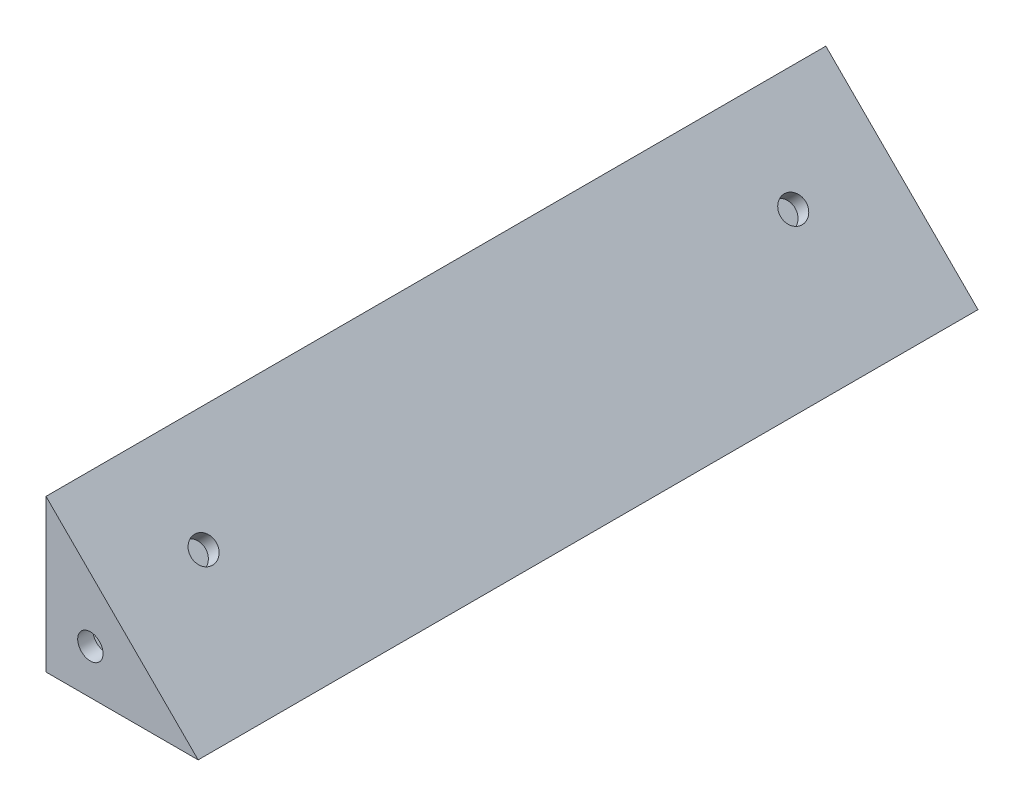
ISO-10303-21;
HEADER;
FILE_DESCRIPTION(('STEP AP214'),'2;1');
FILE_NAME('part.step','',(''),(''),'','','');
FILE_SCHEMA(('AUTOMOTIVE_DESIGN { 1 0 10303 214 1 1 1 1 }'));
ENDSEC;
DATA;
#1=APPLICATION_CONTEXT('core data for automotive mechanical design processes');
#2=APPLICATION_PROTOCOL_DEFINITION('international standard','automotive_design',2000,#1);
#3=PRODUCT_CONTEXT('',#1,'mechanical');
#4=PRODUCT('Part','Part','',(#3));
#5=PRODUCT_RELATED_PRODUCT_CATEGORY('part','',(#4));
#6=PRODUCT_DEFINITION_FORMATION('','',#4);
#7=PRODUCT_DEFINITION_CONTEXT('part definition',#1,'design');
#8=PRODUCT_DEFINITION('design','',#6,#7);
#9=PRODUCT_DEFINITION_SHAPE('','',#8);
#10=(LENGTH_UNIT() NAMED_UNIT(*) SI_UNIT(.MILLI.,.METRE.));
#11=(NAMED_UNIT(*) PLANE_ANGLE_UNIT() SI_UNIT($,.RADIAN.));
#12=(NAMED_UNIT(*) SI_UNIT($,.STERADIAN.) SOLID_ANGLE_UNIT());
#13=UNCERTAINTY_MEASURE_WITH_UNIT(LENGTH_MEASURE(1.E-05),#10,'distance_accuracy_value','');
#14=(GEOMETRIC_REPRESENTATION_CONTEXT(3) GLOBAL_UNCERTAINTY_ASSIGNED_CONTEXT((#13)) GLOBAL_UNIT_ASSIGNED_CONTEXT((#10,
#11,#12)) REPRESENTATION_CONTEXT('',''));
#15=CARTESIAN_POINT('',(0.,0.,0.));
#16=DIRECTION('',(0.,0.,1.));
#17=DIRECTION('',(1.,0.,0.));
#18=AXIS2_PLACEMENT_3D('',#15,#16,#17);
#19=CARTESIAN_POINT('',(3.73725830020305,3.73725830020305,5.));
#20=DIRECTION('',(0.,0.,-1.));
#21=DIRECTION('',(0.,1.,0.));
#22=AXIS2_PLACEMENT_3D('',#19,#20,#21);
#23=PLANE('',#22);
#24=DIRECTION('',(-0.707106781186547,0.707106781186548,0.));
#25=VECTOR('',#24,1.);
#26=CARTESIAN_POINT('',(5.15147186257615,5.15147186257615,5.));
#27=LINE('',#26,#25);
#28=CARTESIAN_POINT('',(10.3029437251523,0.,5.));
#29=VERTEX_POINT('',#28);
#30=CARTESIAN_POINT('',(3.05978332455101,7.24316040060128,5.));
#31=VERTEX_POINT('',#30);
#32=EDGE_CURVE('E245',#29,#31,#27,.T.);
#33=ORIENTED_EDGE('',*,*,#32,.T.);
#34=DIRECTION('',(0.707106781186548,0.707106781186548,0.));
#35=VECTOR('',#34,1.);
#36=CARTESIAN_POINT('',(1.64556976217791,5.82894683822819,5.));
#37=LINE('',#36,#35);
#38=CARTESIAN_POINT('',(1.64556976217791,5.82894683822819,5.));
#39=VERTEX_POINT('',#38);
#40=EDGE_CURVE('E338',#39,#31,#37,.T.);
#41=ORIENTED_EDGE('',*,*,#40,.F.);
#42=DIRECTION('',(-0.707106781186547,0.707106781186548,0.));
#43=VECTOR('',#42,1.);
#44=CARTESIAN_POINT('',(3.73725830020305,3.73725830020305,5.));
#45=LINE('',#44,#43);
#46=CARTESIAN_POINT('',(7.4745166004061,0.,5.));
#47=VERTEX_POINT('',#46);
#48=EDGE_CURVE('E247',#47,#39,#45,.T.);
#49=ORIENTED_EDGE('',*,*,#48,.F.);
#50=DIRECTION('',(-1.,0.,0.));
#51=VECTOR('',#50,1.);
#52=CARTESIAN_POINT('',(0.,0.,5.));
#53=LINE('',#52,#51);
#54=EDGE_CURVE('E239',#29,#47,#53,.T.);
#55=ORIENTED_EDGE('',*,*,#54,.F.);
#56=EDGE_LOOP('',(#33,#41,#49,#55));
#57=FACE_BOUND('',#56,.T.);
#58=ADVANCED_FACE('F80',(#57),#23,.F.);
#59=CARTESIAN_POINT('',(3.73725830020305,3.73725830020305,10.));
#60=DIRECTION('',(0.,0.,1.));
#61=DIRECTION('',(1.,0.,0.));
#62=AXIS2_PLACEMENT_3D('',#59,#60,#61);
#63=PLANE('',#62);
#64=DIRECTION('',(0.707106781186547,-0.707106781186548,0.));
#65=VECTOR('',#64,1.);
#66=CARTESIAN_POINT('',(5.15147186257615,5.15147186257615,10.));
#67=LINE('',#66,#65);
#68=CARTESIAN_POINT('',(3.05978332455101,7.24316040060128,10.));
#69=VERTEX_POINT('',#68);
#70=CARTESIAN_POINT('',(10.3029437251523,0.,10.));
#71=VERTEX_POINT('',#70);
#72=EDGE_CURVE('E268',#69,#71,#67,.T.);
#73=ORIENTED_EDGE('',*,*,#72,.T.);
#74=DIRECTION('',(1.,0.,0.));
#75=VECTOR('',#74,1.);
#76=CARTESIAN_POINT('',(0.,0.,10.));
#77=LINE('',#76,#75);
#78=CARTESIAN_POINT('',(7.4745166004061,0.,10.));
#79=VERTEX_POINT('',#78);
#80=EDGE_CURVE('E241',#79,#71,#77,.T.);
#81=ORIENTED_EDGE('',*,*,#80,.F.);
#82=DIRECTION('',(0.707106781186547,-0.707106781186548,0.));
#83=VECTOR('',#82,1.);
#84=CARTESIAN_POINT('',(3.73725830020305,3.73725830020305,10.));
#85=LINE('',#84,#83);
#86=CARTESIAN_POINT('',(1.64556976217791,5.82894683822819,10.));
#87=VERTEX_POINT('',#86);
#88=EDGE_CURVE('E334',#87,#79,#85,.T.);
#89=ORIENTED_EDGE('',*,*,#88,.F.);
#90=DIRECTION('',(0.707106781186548,0.707106781186548,0.));
#91=VECTOR('',#90,1.);
#92=CARTESIAN_POINT('',(1.64556976217791,5.82894683822819,10.));
#93=LINE('',#92,#91);
#94=EDGE_CURVE('E301',#87,#69,#93,.T.);
#95=ORIENTED_EDGE('',*,*,#94,.T.);
#96=EDGE_LOOP('',(#73,#81,#89,#95));
#97=FACE_BOUND('',#96,.T.);
#98=ADVANCED_FACE('F553',(#97),#63,.F.);
#99=CARTESIAN_POINT('',(-0.893370281794774,8.36788688220088,3.78089240474743));
#100=DIRECTION('',(-0.612372435695794,0.612372435695795,0.5));
#101=DIRECTION('',(-0.707106781186548,-0.707106781186548,0.));
#102=AXIS2_PLACEMENT_3D('',#99,#100,#101);
#103=PLANE('',#102);
#104=DIRECTION('',(0.353553390593274,-0.353553390593274,0.866025403784439));
#105=VECTOR('',#104,1.);
#106=CARTESIAN_POINT('',(0.520843280578321,9.78210044457397,3.78089240474743));
#107=LINE('',#106,#105);
#108=CARTESIAN_POINT('',(2.03916259839135,8.26378112676094,7.5));
#109=VERTEX_POINT('',#108);
#110=EDGE_CURVE('E102',#109,#69,#107,.T.);
#111=ORIENTED_EDGE('',*,*,#110,.T.);
#112=ORIENTED_EDGE('',*,*,#94,.F.);
#113=DIRECTION('',(0.353553390593274,-0.353553390593274,0.866025403784439));
#114=VECTOR('',#113,1.);
#115=CARTESIAN_POINT('',(-0.893370281794774,8.36788688220088,3.78089240474743));
#116=LINE('',#115,#114);
#117=CARTESIAN_POINT('',(0.624949036018256,6.84956756438784,7.5));
#118=VERTEX_POINT('',#117);
#119=EDGE_CURVE('E330',#118,#87,#116,.T.);
#120=ORIENTED_EDGE('',*,*,#119,.F.);
#121=DIRECTION('',(0.707106781186548,0.707106781186548,0.));
#122=VECTOR('',#121,1.);
#123=CARTESIAN_POINT('',(0.624949036018256,6.84956756438784,7.5));
#124=LINE('',#123,#122);
#125=EDGE_CURVE('E341',#118,#109,#124,.T.);
#126=ORIENTED_EDGE('',*,*,#125,.T.);
#127=EDGE_LOOP('',(#111,#112,#120,#126));
#128=FACE_BOUND('',#127,.T.);
#129=ADVANCED_FACE('F558',(#128),#103,.F.);
#130=CARTESIAN_POINT('',(3.69942298592369,3.77509361448241,-0.0308924047474255));
#131=DIRECTION('',(-0.612372435695794,0.612372435695794,-0.500000000000001));
#132=DIRECTION('',(-0.707106781186548,-0.707106781186548,0.));
#133=AXIS2_PLACEMENT_3D('',#130,#131,#132);
#134=PLANE('',#133);
#135=DIRECTION('',(-0.353553390593274,0.353553390593274,0.866025403784438));
#136=VECTOR('',#135,1.);
#137=CARTESIAN_POINT('',(5.11363654829678,5.18930717685551,-0.0308924047474255));
#138=LINE('',#137,#136);
#139=EDGE_CURVE('E254',#31,#109,#138,.T.);
#140=ORIENTED_EDGE('',*,*,#139,.T.);
#141=ORIENTED_EDGE('',*,*,#125,.F.);
#142=DIRECTION('',(-0.353553390593274,0.353553390593274,0.866025403784438));
#143=VECTOR('',#142,1.);
#144=CARTESIAN_POINT('',(3.69942298592369,3.77509361448241,-0.0308924047474255));
#145=LINE('',#144,#143);
#146=EDGE_CURVE('E326',#39,#118,#145,.T.);
#147=ORIENTED_EDGE('',*,*,#146,.F.);
#148=ORIENTED_EDGE('',*,*,#40,.T.);
#149=EDGE_LOOP('',(#140,#141,#147,#148));
#150=FACE_BOUND('',#149,.T.);
#151=ADVANCED_FACE('F563',(#150),#134,.F.);
#152=CARTESIAN_POINT('',(3.73725830020305,3.73725830020305,56.5));
#153=DIRECTION('',(0.,0.,1.));
#154=DIRECTION('',(1.,0.,0.));
#155=AXIS2_PLACEMENT_3D('',#152,#153,#154);
#156=PLANE('',#155);
#157=DIRECTION('',(0.707106781186547,-0.707106781186548,0.));
#158=VECTOR('',#157,1.);
#159=CARTESIAN_POINT('',(5.15147186257615,5.15147186257615,56.5));
#160=LINE('',#159,#158);
#161=CARTESIAN_POINT('',(3.05978332455102,7.24316040060128,56.5));
#162=VERTEX_POINT('',#161);
#163=CARTESIAN_POINT('',(10.3029437251523,0.,56.5));
#164=VERTEX_POINT('',#163);
#165=EDGE_CURVE('E280',#162,#164,#160,.T.);
#166=ORIENTED_EDGE('',*,*,#165,.T.);
#167=DIRECTION('',(1.,0.,0.));
#168=VECTOR('',#167,1.);
#169=CARTESIAN_POINT('',(0.,0.,56.5));
#170=LINE('',#169,#168);
#171=CARTESIAN_POINT('',(7.4745166004061,0.,56.5));
#172=VERTEX_POINT('',#171);
#173=EDGE_CURVE('E350',#172,#164,#170,.T.);
#174=ORIENTED_EDGE('',*,*,#173,.F.);
#175=DIRECTION('',(0.707106781186547,-0.707106781186548,0.));
#176=VECTOR('',#175,1.);
#177=CARTESIAN_POINT('',(3.73725830020305,3.73725830020305,56.5));
#178=LINE('',#177,#176);
#179=CARTESIAN_POINT('',(1.64556976217792,5.82894683822819,56.5));
#180=VERTEX_POINT('',#179);
#181=EDGE_CURVE('E296',#180,#172,#178,.T.);
#182=ORIENTED_EDGE('',*,*,#181,.F.);
#183=DIRECTION('',(0.707106781186548,0.707106781186548,0.));
#184=VECTOR('',#183,1.);
#185=CARTESIAN_POINT('',(1.64556976217792,5.82894683822819,56.5));
#186=LINE('',#185,#184);
#187=EDGE_CURVE('E313',#180,#162,#186,.T.);
#188=ORIENTED_EDGE('',*,*,#187,.T.);
#189=EDGE_LOOP('',(#166,#174,#182,#188));
#190=FACE_BOUND('',#189,.T.);
#191=ADVANCED_FACE('F535',(#190),#156,.F.);
#192=CARTESIAN_POINT('',(3.73725830020305,3.73725830020305,51.5));
#193=DIRECTION('',(0.,0.,-1.));
#194=DIRECTION('',(-1.,0.,0.));
#195=AXIS2_PLACEMENT_3D('',#192,#193,#194);
#196=PLANE('',#195);
#197=DIRECTION('',(-0.707106781186547,0.707106781186548,0.));
#198=VECTOR('',#197,1.);
#199=CARTESIAN_POINT('',(5.15147186257615,5.15147186257615,51.5));
#200=LINE('',#199,#198);
#201=CARTESIAN_POINT('',(10.3029437251523,0.,51.5));
#202=VERTEX_POINT('',#201);
#203=CARTESIAN_POINT('',(3.05978332455101,7.24316040060129,51.5));
#204=VERTEX_POINT('',#203);
#205=EDGE_CURVE('E284',#202,#204,#200,.T.);
#206=ORIENTED_EDGE('',*,*,#205,.T.);
#207=DIRECTION('',(0.707106781186548,0.707106781186548,0.));
#208=VECTOR('',#207,1.);
#209=CARTESIAN_POINT('',(1.64556976217791,5.82894683822819,51.5));
#210=LINE('',#209,#208);
#211=CARTESIAN_POINT('',(1.64556976217791,5.82894683822819,51.5));
#212=VERTEX_POINT('',#211);
#213=EDGE_CURVE('E312',#212,#204,#210,.T.);
#214=ORIENTED_EDGE('',*,*,#213,.F.);
#215=DIRECTION('',(-0.707106781186547,0.707106781186548,0.));
#216=VECTOR('',#215,1.);
#217=CARTESIAN_POINT('',(3.73725830020305,3.73725830020305,51.5));
#218=LINE('',#217,#216);
#219=CARTESIAN_POINT('',(7.4745166004061,0.,51.5));
#220=VERTEX_POINT('',#219);
#221=EDGE_CURVE('E300',#220,#212,#218,.T.);
#222=ORIENTED_EDGE('',*,*,#221,.F.);
#223=DIRECTION('',(-1.,0.,0.));
#224=VECTOR('',#223,1.);
#225=CARTESIAN_POINT('',(0.,0.,51.5));
#226=LINE('',#225,#224);
#227=EDGE_CURVE('E249',#202,#220,#226,.T.);
#228=ORIENTED_EDGE('',*,*,#227,.F.);
#229=EDGE_LOOP('',(#206,#214,#222,#228));
#230=FACE_BOUND('',#229,.T.);
#231=ADVANCED_FACE('F523',(#230),#196,.F.);
#232=CARTESIAN_POINT('',(-15.131029411722,22.6055460121281,15.4058924047474));
#233=DIRECTION('',(-0.612372435695794,0.612372435695795,0.5));
#234=DIRECTION('',(-0.707106781186548,-0.707106781186548,0.));
#235=AXIS2_PLACEMENT_3D('',#232,#233,#234);
#236=PLANE('',#235);
#237=DIRECTION('',(0.353553390593274,-0.353553390593274,0.866025403784439));
#238=VECTOR('',#237,1.);
#239=CARTESIAN_POINT('',(-13.7168158493489,24.0197595745012,15.4058924047474));
#240=LINE('',#239,#238);
#241=CARTESIAN_POINT('',(2.03916259839135,8.26378112676094,54.));
#242=VERTEX_POINT('',#241);
#243=EDGE_CURVE('E290',#242,#162,#240,.T.);
#244=ORIENTED_EDGE('',*,*,#243,.T.);
#245=ORIENTED_EDGE('',*,*,#187,.F.);
#246=DIRECTION('',(0.353553390593274,-0.353553390593274,0.866025403784439));
#247=VECTOR('',#246,1.);
#248=CARTESIAN_POINT('',(-15.131029411722,22.6055460121281,15.4058924047474));
#249=LINE('',#248,#247);
#250=CARTESIAN_POINT('',(0.624949036018258,6.84956756438785,54.));
#251=VERTEX_POINT('',#250);
#252=EDGE_CURVE('E308',#251,#180,#249,.T.);
#253=ORIENTED_EDGE('',*,*,#252,.F.);
#254=DIRECTION('',(0.707106781186548,0.707106781186548,0.));
#255=VECTOR('',#254,1.);
#256=CARTESIAN_POINT('',(0.624949036018258,6.84956756438785,54.));
#257=LINE('',#256,#255);
#258=EDGE_CURVE('E317',#251,#242,#257,.T.);
#259=ORIENTED_EDGE('',*,*,#258,.T.);
#260=EDGE_LOOP('',(#244,#245,#253,#259));
#261=FACE_BOUND('',#260,.T.);
#262=ADVANCED_FACE('F531',(#261),#236,.F.);
#263=CARTESIAN_POINT('',(17.9370821158509,-10.4625655154448,11.5941075952526));
#264=DIRECTION('',(-0.612372435695794,0.612372435695795,-0.5));
#265=DIRECTION('',(-0.707106781186548,-0.707106781186548,0.));
#266=AXIS2_PLACEMENT_3D('',#263,#264,#265);
#267=PLANE('',#266);
#268=DIRECTION('',(-0.353553390593274,0.353553390593274,0.866025403784439));
#269=VECTOR('',#268,1.);
#270=CARTESIAN_POINT('',(19.351295678224,-9.04835195307171,11.5941075952526));
#271=LINE('',#270,#269);
#272=EDGE_CURVE('E287',#204,#242,#271,.T.);
#273=ORIENTED_EDGE('',*,*,#272,.T.);
#274=ORIENTED_EDGE('',*,*,#258,.F.);
#275=DIRECTION('',(-0.353553390593274,0.353553390593274,0.866025403784439));
#276=VECTOR('',#275,1.);
#277=CARTESIAN_POINT('',(17.9370821158509,-10.4625655154448,11.5941075952526));
#278=LINE('',#277,#276);
#279=EDGE_CURVE('E304',#212,#251,#278,.T.);
#280=ORIENTED_EDGE('',*,*,#279,.F.);
#281=ORIENTED_EDGE('',*,*,#213,.T.);
#282=EDGE_LOOP('',(#273,#274,#280,#281));
#283=FACE_BOUND('',#282,.T.);
#284=ADVANCED_FACE('F528',(#283),#267,.F.);
#285=CARTESIAN_POINT('',(1.73223304703364,1.73223304703364,58.3));
#286=DIRECTION('',(-0.707106781186548,-0.707106781186548,0.));
#287=DIRECTION('',(0.707106781186548,-0.707106781186548,0.));
#288=AXIS2_PLACEMENT_3D('',#285,#286,#287);
#289=PLANE('',#288);
#290=DIRECTION('',(0.707106781186547,-0.707106781186548,0.));
#291=VECTOR('',#290,1.);
#292=CARTESIAN_POINT('',(1.73223304703364,1.73223304703364,60.3));
#293=LINE('',#292,#291);
#294=CARTESIAN_POINT('',(0.711612320873983,2.75285377319329,60.3));
#295=VERTEX_POINT('',#294);
#296=CARTESIAN_POINT('',(3.46446609406726,0.,60.3));
#297=VERTEX_POINT('',#296);
#298=EDGE_CURVE('E359',#295,#297,#293,.T.);
#299=ORIENTED_EDGE('',*,*,#298,.T.);
#300=DIRECTION('',(0.,0.,1.));
#301=VECTOR('',#300,1.);
#302=CARTESIAN_POINT('',(3.46446609406726,0.,58.3));
#303=LINE('',#302,#301);
#304=CARTESIAN_POINT('',(3.46446609406726,0.,58.3));
#305=VERTEX_POINT('',#304);
#306=EDGE_CURVE('E398',#305,#297,#303,.T.);
#307=ORIENTED_EDGE('',*,*,#306,.F.);
#308=DIRECTION('',(0.707106781186547,-0.707106781186548,0.));
#309=VECTOR('',#308,1.);
#310=CARTESIAN_POINT('',(1.73223304703364,1.73223304703364,58.3));
#311=LINE('',#310,#309);
#312=CARTESIAN_POINT('',(0.711612320873983,2.75285377319329,58.3));
#313=VERTEX_POINT('',#312);
#314=EDGE_CURVE('E375',#313,#305,#311,.T.);
#315=ORIENTED_EDGE('',*,*,#314,.F.);
#316=DIRECTION('',(0.,0.,1.));
#317=VECTOR('',#316,1.);
#318=CARTESIAN_POINT('',(0.711612320873983,2.75285377319329,58.3));
#319=LINE('',#318,#317);
#320=EDGE_CURVE('E399',#313,#295,#319,.T.);
#321=ORIENTED_EDGE('',*,*,#320,.T.);
#322=EDGE_LOOP('',(#299,#307,#315,#321));
#323=FACE_BOUND('',#322,.T.);
#324=ADVANCED_FACE('F583',(#323),#289,.F.);
#325=CARTESIAN_POINT('',(-0.0242701090998959,0.00650315613353235,58.3));
#326=DIRECTION('',(-0.965925826289068,0.258819045102521,0.));
#327=DIRECTION('',(-0.258819045102521,-0.965925826289068,0.));
#328=AXIS2_PLACEMENT_3D('',#325,#326,#327);
#329=PLANE('',#328);
#330=DIRECTION('',(-0.258819045102521,-0.965925826289068,0.));
#331=VECTOR('',#330,1.);
#332=CARTESIAN_POINT('',(-0.0242701090998959,0.00650315613353235,60.3));
#333=LINE('',#332,#331);
#334=CARTESIAN_POINT('',(1.45875854768069,5.54124145231931,60.3));
#335=VERTEX_POINT('',#334);
#336=EDGE_CURVE('E372',#335,#295,#333,.T.);
#337=ORIENTED_EDGE('',*,*,#336,.T.);
#338=ORIENTED_EDGE('',*,*,#320,.F.);
#339=DIRECTION('',(-0.258819045102521,-0.965925826289068,0.));
#340=VECTOR('',#339,1.);
#341=CARTESIAN_POINT('',(-0.0242701090998959,0.00650315613353235,58.3));
#342=LINE('',#341,#340);
#343=CARTESIAN_POINT('',(1.45875854768069,5.54124145231931,58.3));
#344=VERTEX_POINT('',#343);
#345=EDGE_CURVE('E394',#344,#313,#342,.T.);
#346=ORIENTED_EDGE('',*,*,#345,.F.);
#347=DIRECTION('',(0.,0.,1.));
#348=VECTOR('',#347,1.);
#349=CARTESIAN_POINT('',(1.45875854768069,5.54124145231931,58.3));
#350=LINE('',#349,#348);
#351=EDGE_CURVE('E404',#344,#335,#350,.T.);
#352=ORIENTED_EDGE('',*,*,#351,.T.);
#353=EDGE_LOOP('',(#337,#338,#346,#352));
#354=FACE_BOUND('',#353,.T.);
#355=ADVANCED_FACE('F579',(#354),#329,.F.);
#356=CARTESIAN_POINT('',(-1.28759206937907,4.80535902234543,58.3));
#357=DIRECTION('',(-0.258819045102521,0.965925826289068,0.));
#358=DIRECTION('',(-0.965925826289068,-0.258819045102521,0.));
#359=AXIS2_PLACEMENT_3D('',#356,#357,#358);
#360=PLANE('',#359);
#361=DIRECTION('',(-0.965925826289068,-0.258819045102521,0.));
#362=VECTOR('',#361,1.);
#363=CARTESIAN_POINT('',(-1.28759206937907,4.80535902234543,60.3));
#364=LINE('',#363,#362);
#365=CARTESIAN_POINT('',(4.24714622680671,6.28838767912602,60.3));
#366=VERTEX_POINT('',#365);
#367=EDGE_CURVE('E369',#366,#335,#364,.T.);
#368=ORIENTED_EDGE('',*,*,#367,.T.);
#369=ORIENTED_EDGE('',*,*,#351,.F.);
#370=DIRECTION('',(-0.965925826289068,-0.258819045102521,0.));
#371=VECTOR('',#370,1.);
#372=CARTESIAN_POINT('',(-1.28759206937907,4.80535902234543,58.3));
#373=LINE('',#372,#371);
#374=CARTESIAN_POINT('',(4.24714622680671,6.28838767912602,58.3));
#375=VERTEX_POINT('',#374);
#376=EDGE_CURVE('E390',#375,#344,#373,.T.);
#377=ORIENTED_EDGE('',*,*,#376,.F.);
#378=DIRECTION('',(0.,0.,1.));
#379=VECTOR('',#378,1.);
#380=CARTESIAN_POINT('',(4.24714622680671,6.28838767912602,58.3));
#381=LINE('',#380,#379);
#382=EDGE_CURVE('E408',#375,#366,#381,.T.);
#383=ORIENTED_EDGE('',*,*,#382,.T.);
#384=EDGE_LOOP('',(#368,#369,#377,#383));
#385=FACE_BOUND('',#384,.T.);
#386=ADVANCED_FACE('F582',(#385),#360,.F.);
#387=CARTESIAN_POINT('',(5.26776695296636,5.26776695296636,58.3));
#388=DIRECTION('',(0.707106781186547,0.707106781186548,0.));
#389=DIRECTION('',(-0.707106781186548,0.707106781186547,0.));
#390=AXIS2_PLACEMENT_3D('',#387,#388,#389);
#391=PLANE('',#390);
#392=DIRECTION('',(-0.707106781186548,0.707106781186547,0.));
#393=VECTOR('',#392,1.);
#394=CARTESIAN_POINT('',(5.26776695296636,5.26776695296636,60.3));
#395=LINE('',#394,#393);
#396=CARTESIAN_POINT('',(10.5355339059327,0.,60.3));
#397=VERTEX_POINT('',#396);
#398=EDGE_CURVE('E366',#397,#366,#395,.T.);
#399=ORIENTED_EDGE('',*,*,#398,.T.);
#400=ORIENTED_EDGE('',*,*,#382,.F.);
#401=DIRECTION('',(-0.707106781186548,0.707106781186547,0.));
#402=VECTOR('',#401,1.);
#403=CARTESIAN_POINT('',(5.26776695296636,5.26776695296636,58.3));
#404=LINE('',#403,#402);
#405=CARTESIAN_POINT('',(10.5355339059327,0.,58.3));
#406=VERTEX_POINT('',#405);
#407=EDGE_CURVE('E386',#406,#375,#404,.T.);
#408=ORIENTED_EDGE('',*,*,#407,.F.);
#409=DIRECTION('',(0.,0.,1.));
#410=VECTOR('',#409,1.);
#411=CARTESIAN_POINT('',(10.5355339059327,0.,58.3));
#412=LINE('',#411,#410);
#413=EDGE_CURVE('E412',#406,#397,#412,.T.);
#414=ORIENTED_EDGE('',*,*,#413,.T.);
#415=EDGE_LOOP('',(#399,#400,#408,#414));
#416=FACE_BOUND('',#415,.T.);
#417=ADVANCED_FACE('F587',(#416),#391,.F.);
#418=CARTESIAN_POINT('',(0.,0.,61.5));
#419=DIRECTION('',(0.,1.,0.));
#420=DIRECTION('',(0.,0.,1.));
#421=AXIS2_PLACEMENT_3D('',#418,#419,#420);
#422=PLANE('',#421);
#423=DIRECTION('',(1.,0.,0.));
#424=VECTOR('',#423,1.);
#425=CARTESIAN_POINT('',(0.,0.,0.));
#426=LINE('',#425,#424);
#427=CARTESIAN_POINT('',(0.,0.,0.));
#428=VERTEX_POINT('',#427);
#429=CARTESIAN_POINT('',(12.,0.,0.));
#430=VERTEX_POINT('',#429);
#431=EDGE_CURVE('E495',#428,#430,#426,.T.);
#432=ORIENTED_EDGE('',*,*,#431,.T.);
#433=DIRECTION('',(0.,0.,-1.));
#434=VECTOR('',#433,1.);
#435=CARTESIAN_POINT('',(12.,0.,61.5));
#436=LINE('',#435,#434);
#437=CARTESIAN_POINT('',(12.,0.,61.5));
#438=VERTEX_POINT('',#437);
#439=EDGE_CURVE('E504',#438,#430,#436,.T.);
#440=ORIENTED_EDGE('',*,*,#439,.F.);
#441=DIRECTION('',(1.,0.,0.));
#442=VECTOR('',#441,1.);
#443=CARTESIAN_POINT('',(0.,0.,61.5));
#444=LINE('',#443,#442);
#445=CARTESIAN_POINT('',(0.,0.,61.5));
#446=VERTEX_POINT('',#445);
#447=EDGE_CURVE('E483',#446,#438,#444,.T.);
#448=ORIENTED_EDGE('',*,*,#447,.F.);
#449=DIRECTION('',(0.,0.,-1.));
#450=VECTOR('',#449,1.);
#451=CARTESIAN_POINT('',(0.,0.,61.5));
#452=LINE('',#451,#450);
#453=EDGE_CURVE('E507',#446,#428,#452,.T.);
#454=ORIENTED_EDGE('',*,*,#453,.T.);
#455=EDGE_LOOP('',(#432,#440,#448,#454));
#456=FACE_BOUND('',#455,.T.);
#457=ORIENTED_EDGE('',*,*,#173,.T.);
#458=DIRECTION('',(0.,0.,1.));
#459=VECTOR('',#458,1.);
#460=CARTESIAN_POINT('',(10.3029437251523,0.,0.));
#461=LINE('',#460,#459);
#462=EDGE_CURVE('E262',#202,#164,#461,.T.);
#463=ORIENTED_EDGE('',*,*,#462,.F.);
#464=ORIENTED_EDGE('',*,*,#227,.T.);
#465=DIRECTION('',(0.,0.,-1.));
#466=VECTOR('',#465,1.);
#467=CARTESIAN_POINT('',(7.4745166004061,0.,61.5));
#468=LINE('',#467,#466);
#469=EDGE_CURVE('E89',#172,#220,#468,.T.);
#470=ORIENTED_EDGE('',*,*,#469,.F.);
#471=EDGE_LOOP('',(#457,#463,#464,#470));
#472=FACE_BOUND('',#471,.T.);
#473=ORIENTED_EDGE('',*,*,#80,.T.);
#474=DIRECTION('',(0.,0.,1.));
#475=VECTOR('',#474,1.);
#476=CARTESIAN_POINT('',(10.3029437251523,0.,0.));
#477=LINE('',#476,#475);
#478=EDGE_CURVE('E12',#29,#71,#477,.T.);
#479=ORIENTED_EDGE('',*,*,#478,.F.);
#480=ORIENTED_EDGE('',*,*,#54,.T.);
#481=DIRECTION('',(0.,0.,-1.));
#482=VECTOR('',#481,1.);
#483=CARTESIAN_POINT('',(7.4745166004061,0.,61.5));
#484=LINE('',#483,#482);
#485=EDGE_CURVE('E510',#79,#47,#484,.T.);
#486=ORIENTED_EDGE('',*,*,#485,.F.);
#487=EDGE_LOOP('',(#473,#479,#480,#486));
#488=FACE_BOUND('',#487,.T.);
#489=DIRECTION('',(1.,0.,0.));
#490=VECTOR('',#489,1.);
#491=CARTESIAN_POINT('',(0.,0.,58.3));
#492=LINE('',#491,#490);
#493=EDGE_CURVE('E382',#305,#406,#492,.T.);
#494=ORIENTED_EDGE('',*,*,#493,.F.);
#495=ORIENTED_EDGE('',*,*,#306,.T.);
#496=DIRECTION('',(1.,0.,0.));
#497=VECTOR('',#496,1.);
#498=CARTESIAN_POINT('',(0.,0.,60.3));
#499=LINE('',#498,#497);
#500=EDGE_CURVE('E362',#297,#397,#499,.T.);
#501=ORIENTED_EDGE('',*,*,#500,.T.);
#502=ORIENTED_EDGE('',*,*,#413,.F.);
#503=EDGE_LOOP('',(#494,#495,#501,#502));
#504=FACE_BOUND('',#503,.T.);
#505=DIRECTION('',(0.,0.,-1.));
#506=VECTOR('',#505,1.);
#507=CARTESIAN_POINT('',(10.5355339059327,0.,3.2));
#508=LINE('',#507,#506);
#509=CARTESIAN_POINT('',(10.5355339059327,0.,3.2));
#510=VERTEX_POINT('',#509);
#511=CARTESIAN_POINT('',(10.5355339059327,0.,1.2));
#512=VERTEX_POINT('',#511);
#513=EDGE_CURVE('E470',#510,#512,#508,.T.);
#514=ORIENTED_EDGE('',*,*,#513,.T.);
#515=DIRECTION('',(1.,0.,0.));
#516=VECTOR('',#515,1.);
#517=CARTESIAN_POINT('',(0.,0.,1.2));
#518=LINE('',#517,#516);
#519=CARTESIAN_POINT('',(3.46446609406726,0.,1.2));
#520=VERTEX_POINT('',#519);
#521=EDGE_CURVE('E426',#520,#512,#518,.T.);
#522=ORIENTED_EDGE('',*,*,#521,.F.);
#523=DIRECTION('',(0.,0.,-1.));
#524=VECTOR('',#523,1.);
#525=CARTESIAN_POINT('',(3.46446609406726,0.,3.2));
#526=LINE('',#525,#524);
#527=CARTESIAN_POINT('',(3.46446609406726,0.,3.2));
#528=VERTEX_POINT('',#527);
#529=EDGE_CURVE('E474',#528,#520,#526,.T.);
#530=ORIENTED_EDGE('',*,*,#529,.F.);
#531=DIRECTION('',(1.,0.,0.));
#532=VECTOR('',#531,1.);
#533=CARTESIAN_POINT('',(0.,0.,3.2));
#534=LINE('',#533,#532);
#535=EDGE_CURVE('E445',#528,#510,#534,.T.);
#536=ORIENTED_EDGE('',*,*,#535,.T.);
#537=EDGE_LOOP('',(#514,#522,#530,#536));
#538=FACE_BOUND('',#537,.T.);
#539=ADVANCED_FACE('F236',(#456,#472,#488,#504,#538),#422,.F.);
#540=CARTESIAN_POINT('',(0.,0.,0.));
#541=DIRECTION('',(0.,0.,1.));
#542=DIRECTION('',(1.,0.,0.));
#543=AXIS2_PLACEMENT_3D('',#540,#541,#542);
#544=PLANE('',#543);
#545=DIRECTION('',(0.707106781186548,-0.707106781186548,0.));
#546=VECTOR('',#545,1.);
#547=CARTESIAN_POINT('',(6.,6.,0.));
#548=LINE('',#547,#546);
#549=CARTESIAN_POINT('',(0.,12.,0.));
#550=VERTEX_POINT('',#549);
#551=EDGE_CURVE('E484',#550,#430,#548,.T.);
#552=ORIENTED_EDGE('',*,*,#551,.T.);
#553=ORIENTED_EDGE('',*,*,#431,.F.);
#554=DIRECTION('',(0.,1.,0.));
#555=VECTOR('',#554,1.);
#556=CARTESIAN_POINT('',(0.,0.,0.));
#557=LINE('',#556,#555);
#558=EDGE_CURVE('E478',#428,#550,#557,.T.);
#559=ORIENTED_EDGE('',*,*,#558,.T.);
#560=EDGE_LOOP('',(#552,#553,#559));
#561=FACE_BOUND('',#560,.T.);
#562=CARTESIAN_POINT('',(3.5,3.5,0.));
#563=DIRECTION('',(0.,0.,1.));
#564=DIRECTION('',(1.,0.,0.));
#565=AXIS2_PLACEMENT_3D('',#562,#563,#564);
#566=CIRCLE('',#565,1.);
#567=CARTESIAN_POINT('',(4.5,3.5,0.));
#568=VERTEX_POINT('',#567);
#569=EDGE_CURVE('E403',#568,#568,#566,.T.);
#570=ORIENTED_EDGE('',*,*,#569,.T.);
#571=EDGE_LOOP('',(#570));
#572=FACE_BOUND('',#571,.T.);
#573=ADVANCED_FACE('F627',(#561,#572),#544,.F.);
#574=CARTESIAN_POINT('',(0.,0.,61.5));
#575=DIRECTION('',(-1.,0.,0.));
#576=DIRECTION('',(0.,0.,1.));
#577=AXIS2_PLACEMENT_3D('',#574,#575,#576);
#578=PLANE('',#577);
#579=ORIENTED_EDGE('',*,*,#558,.F.);
#580=ORIENTED_EDGE('',*,*,#453,.F.);
#581=DIRECTION('',(0.,1.,0.));
#582=VECTOR('',#581,1.);
#583=CARTESIAN_POINT('',(0.,0.,61.5));
#584=LINE('',#583,#582);
#585=CARTESIAN_POINT('',(0.,12.,61.5));
#586=VERTEX_POINT('',#585);
#587=EDGE_CURVE('E479',#446,#586,#584,.T.);
#588=ORIENTED_EDGE('',*,*,#587,.T.);
#589=DIRECTION('',(0.,0.,-1.));
#590=VECTOR('',#589,1.);
#591=CARTESIAN_POINT('',(0.,12.,61.5));
#592=LINE('',#591,#590);
#593=EDGE_CURVE('E491',#586,#550,#592,.T.);
#594=ORIENTED_EDGE('',*,*,#593,.T.);
#595=EDGE_LOOP('',(#579,#580,#588,#594));
#596=FACE_BOUND('',#595,.T.);
#597=ADVANCED_FACE('F82',(#596),#578,.T.);
#598=CARTESIAN_POINT('',(6.,6.,61.5));
#599=DIRECTION('',(0.707106781186548,0.707106781186548,0.));
#600=DIRECTION('',(-0.707106781186548,0.707106781186548,0.));
#601=AXIS2_PLACEMENT_3D('',#598,#599,#600);
#602=PLANE('',#601);
#603=ORIENTED_EDGE('',*,*,#439,.T.);
#604=ORIENTED_EDGE('',*,*,#551,.F.);
#605=ORIENTED_EDGE('',*,*,#593,.F.);
#606=DIRECTION('',(0.707106781186548,-0.707106781186548,0.));
#607=VECTOR('',#606,1.);
#608=CARTESIAN_POINT('',(6.,6.,61.5));
#609=LINE('',#608,#607);
#610=EDGE_CURVE('E487',#586,#438,#609,.T.);
#611=ORIENTED_EDGE('',*,*,#610,.T.);
#612=EDGE_LOOP('',(#603,#604,#605,#611));
#613=FACE_BOUND('',#612,.T.);
#614=CARTESIAN_POINT('',(4.92893218813453,7.07106781186548,54.));
#615=DIRECTION('',(0.707106781186548,0.707106781186547,0.));
#616=DIRECTION('',(-0.707106781186547,0.707106781186548,0.));
#617=AXIS2_PLACEMENT_3D('',#614,#615,#616);
#618=CIRCLE('',#617,0.999999999999998);
#619=CARTESIAN_POINT('',(4.22182540694798,7.77817459305202,54.));
#620=VERTEX_POINT('',#619);
#621=EDGE_CURVE('E274',#620,#620,#618,.T.);
#622=ORIENTED_EDGE('',*,*,#621,.F.);
#623=EDGE_LOOP('',(#622));
#624=FACE_BOUND('',#623,.T.);
#625=CARTESIAN_POINT('',(4.92893218813453,7.07106781186548,7.5));
#626=DIRECTION('',(0.707106781186548,0.707106781186547,0.));
#627=DIRECTION('',(-0.707106781186547,0.707106781186548,0.));
#628=AXIS2_PLACEMENT_3D('',#625,#626,#627);
#629=CIRCLE('',#628,1.);
#630=CARTESIAN_POINT('',(4.22182540694798,7.77817459305203,7.5));
#631=VERTEX_POINT('',#630);
#632=EDGE_CURVE('E256',#631,#631,#629,.T.);
#633=ORIENTED_EDGE('',*,*,#632,.F.);
#634=EDGE_LOOP('',(#633));
#635=FACE_BOUND('',#634,.T.);
#636=ADVANCED_FACE('F625',(#613,#624,#635),#602,.T.);
#637=CARTESIAN_POINT('',(0.,0.,61.5));
#638=DIRECTION('',(0.,0.,1.));
#639=DIRECTION('',(1.,0.,0.));
#640=AXIS2_PLACEMENT_3D('',#637,#638,#639);
#641=PLANE('',#640);
#642=ORIENTED_EDGE('',*,*,#447,.T.);
#643=ORIENTED_EDGE('',*,*,#610,.F.);
#644=ORIENTED_EDGE('',*,*,#587,.F.);
#645=EDGE_LOOP('',(#642,#643,#644));
#646=FACE_BOUND('',#645,.T.);
#647=CARTESIAN_POINT('',(3.5,3.5,61.5));
#648=DIRECTION('',(0.,0.,1.));
#649=DIRECTION('',(1.,0.,0.));
#650=AXIS2_PLACEMENT_3D('',#647,#648,#649);
#651=CIRCLE('',#650,1.);
#652=CARTESIAN_POINT('',(4.5,3.5,61.5));
#653=VERTEX_POINT('',#652);
#654=EDGE_CURVE('E354',#653,#653,#651,.T.);
#655=ORIENTED_EDGE('',*,*,#654,.F.);
#656=EDGE_LOOP('',(#655));
#657=FACE_BOUND('',#656,.T.);
#658=ADVANCED_FACE('F618',(#646,#657),#641,.T.);
#659=CARTESIAN_POINT('',(5.26776695296637,5.26776695296637,3.2));
#660=DIRECTION('',(-0.707106781186547,-0.707106781186548,0.));
#661=DIRECTION('',(0.707106781186548,-0.707106781186547,0.));
#662=AXIS2_PLACEMENT_3D('',#659,#660,#661);
#663=PLANE('',#662);
#664=DIRECTION('',(-0.707106781186548,0.707106781186547,0.));
#665=VECTOR('',#664,1.);
#666=CARTESIAN_POINT('',(5.26776695296637,5.26776695296637,1.2));
#667=LINE('',#666,#665);
#668=CARTESIAN_POINT('',(4.24714622680671,6.28838767912603,1.2));
#669=VERTEX_POINT('',#668);
#670=EDGE_CURVE('E429',#512,#669,#667,.T.);
#671=ORIENTED_EDGE('',*,*,#670,.F.);
#672=ORIENTED_EDGE('',*,*,#513,.F.);
#673=DIRECTION('',(-0.707106781186548,0.707106781186547,0.));
#674=VECTOR('',#673,1.);
#675=CARTESIAN_POINT('',(5.26776695296637,5.26776695296637,3.2));
#676=LINE('',#675,#674);
#677=CARTESIAN_POINT('',(4.24714622680671,6.28838767912603,3.2));
#678=VERTEX_POINT('',#677);
#679=EDGE_CURVE('E449',#510,#678,#676,.T.);
#680=ORIENTED_EDGE('',*,*,#679,.T.);
#681=DIRECTION('',(0.,0.,-1.));
#682=VECTOR('',#681,1.);
#683=CARTESIAN_POINT('',(4.24714622680671,6.28838767912603,3.2));
#684=LINE('',#683,#682);
#685=EDGE_CURVE('E466',#678,#669,#684,.T.);
#686=ORIENTED_EDGE('',*,*,#685,.T.);
#687=EDGE_LOOP('',(#671,#672,#680,#686));
#688=FACE_BOUND('',#687,.T.);
#689=ADVANCED_FACE('F614',(#688),#663,.T.);
#690=CARTESIAN_POINT('',(-1.28759206937907,4.80535902234544,3.2));
#691=DIRECTION('',(0.258819045102521,-0.965925826289068,0.));
#692=DIRECTION('',(0.965925826289068,0.258819045102521,0.));
#693=AXIS2_PLACEMENT_3D('',#690,#691,#692);
#694=PLANE('',#693);
#695=DIRECTION('',(-0.965925826289068,-0.258819045102521,0.));
#696=VECTOR('',#695,1.);
#697=CARTESIAN_POINT('',(-1.28759206937907,4.80535902234544,1.2));
#698=LINE('',#697,#696);
#699=CARTESIAN_POINT('',(1.45875854768068,5.54124145231932,1.2));
#700=VERTEX_POINT('',#699);
#701=EDGE_CURVE('E432',#669,#700,#698,.T.);
#702=ORIENTED_EDGE('',*,*,#701,.F.);
#703=ORIENTED_EDGE('',*,*,#685,.F.);
#704=DIRECTION('',(-0.965925826289068,-0.258819045102521,0.));
#705=VECTOR('',#704,1.);
#706=CARTESIAN_POINT('',(-1.28759206937907,4.80535902234544,3.2));
#707=LINE('',#706,#705);
#708=CARTESIAN_POINT('',(1.45875854768068,5.54124145231932,3.2));
#709=VERTEX_POINT('',#708);
#710=EDGE_CURVE('E452',#678,#709,#707,.T.);
#711=ORIENTED_EDGE('',*,*,#710,.T.);
#712=DIRECTION('',(0.,0.,-1.));
#713=VECTOR('',#712,1.);
#714=CARTESIAN_POINT('',(1.45875854768068,5.54124145231932,3.2));
#715=LINE('',#714,#713);
#716=EDGE_CURVE('E462',#709,#700,#715,.T.);
#717=ORIENTED_EDGE('',*,*,#716,.T.);
#718=EDGE_LOOP('',(#702,#703,#711,#717));
#719=FACE_BOUND('',#718,.T.);
#720=ADVANCED_FACE('F610',(#719),#694,.T.);
#721=CARTESIAN_POINT('',(-0.0242701090999039,0.00650315613353448,3.2));
#722=DIRECTION('',(0.965925826289068,-0.258819045102521,0.));
#723=DIRECTION('',(0.258819045102521,0.965925826289068,0.));
#724=AXIS2_PLACEMENT_3D('',#721,#722,#723);
#725=PLANE('',#724);
#726=DIRECTION('',(-0.258819045102521,-0.965925826289068,0.));
#727=VECTOR('',#726,1.);
#728=CARTESIAN_POINT('',(-0.0242701090999039,0.00650315613353448,1.2));
#729=LINE('',#728,#727);
#730=CARTESIAN_POINT('',(0.711612320873972,2.75285377319329,1.2));
#731=VERTEX_POINT('',#730);
#732=EDGE_CURVE('E435',#700,#731,#729,.T.);
#733=ORIENTED_EDGE('',*,*,#732,.F.);
#734=ORIENTED_EDGE('',*,*,#716,.F.);
#735=DIRECTION('',(-0.258819045102521,-0.965925826289068,0.));
#736=VECTOR('',#735,1.);
#737=CARTESIAN_POINT('',(-0.0242701090999039,0.00650315613353448,3.2));
#738=LINE('',#737,#736);
#739=CARTESIAN_POINT('',(0.711612320873972,2.75285377319329,3.2));
#740=VERTEX_POINT('',#739);
#741=EDGE_CURVE('E455',#709,#740,#738,.T.);
#742=ORIENTED_EDGE('',*,*,#741,.T.);
#743=DIRECTION('',(0.,0.,-1.));
#744=VECTOR('',#743,1.);
#745=CARTESIAN_POINT('',(0.711612320873972,2.75285377319329,3.2));
#746=LINE('',#745,#744);
#747=EDGE_CURVE('E458',#740,#731,#746,.T.);
#748=ORIENTED_EDGE('',*,*,#747,.T.);
#749=EDGE_LOOP('',(#733,#734,#742,#748));
#750=FACE_BOUND('',#749,.T.);
#751=ADVANCED_FACE('F607',(#750),#725,.T.);
#752=CARTESIAN_POINT('',(1.73223304703363,1.73223304703363,3.2));
#753=DIRECTION('',(0.707106781186548,0.707106781186548,0.));
#754=DIRECTION('',(-0.707106781186548,0.707106781186548,0.));
#755=AXIS2_PLACEMENT_3D('',#752,#753,#754);
#756=PLANE('',#755);
#757=DIRECTION('',(0.707106781186548,-0.707106781186548,0.));
#758=VECTOR('',#757,1.);
#759=CARTESIAN_POINT('',(1.73223304703363,1.73223304703363,1.2));
#760=LINE('',#759,#758);
#761=EDGE_CURVE('E422',#731,#520,#760,.T.);
#762=ORIENTED_EDGE('',*,*,#761,.F.);
#763=ORIENTED_EDGE('',*,*,#747,.F.);
#764=DIRECTION('',(0.707106781186548,-0.707106781186548,0.));
#765=VECTOR('',#764,1.);
#766=CARTESIAN_POINT('',(1.73223304703363,1.73223304703363,3.2));
#767=LINE('',#766,#765);
#768=EDGE_CURVE('E438',#740,#528,#767,.T.);
#769=ORIENTED_EDGE('',*,*,#768,.T.);
#770=ORIENTED_EDGE('',*,*,#529,.T.);
#771=EDGE_LOOP('',(#762,#763,#769,#770));
#772=FACE_BOUND('',#771,.T.);
#773=ADVANCED_FACE('F605',(#772),#756,.T.);
#774=CARTESIAN_POINT('',(0.,0.,3.2));
#775=DIRECTION('',(0.,0.,1.));
#776=DIRECTION('',(1.,0.,0.));
#777=AXIS2_PLACEMENT_3D('',#774,#775,#776);
#778=PLANE('',#777);
#779=ORIENTED_EDGE('',*,*,#768,.F.);
#780=ORIENTED_EDGE('',*,*,#741,.F.);
#781=ORIENTED_EDGE('',*,*,#710,.F.);
#782=ORIENTED_EDGE('',*,*,#679,.F.);
#783=ORIENTED_EDGE('',*,*,#535,.F.);
#784=EDGE_LOOP('',(#779,#780,#781,#782,#783));
#785=FACE_BOUND('',#784,.T.);
#786=ADVANCED_FACE('F601',(#785),#778,.F.);
#787=CARTESIAN_POINT('',(3.5,3.5,1.2));
#788=DIRECTION('',(0.,0.,-1.));
#789=DIRECTION('',(-1.,0.,0.));
#790=AXIS2_PLACEMENT_3D('',#787,#788,#789);
#791=CYLINDRICAL_SURFACE('',#790,1.);
#792=CARTESIAN_POINT('',(3.5,3.5,1.2));
#793=DIRECTION('',(0.,0.,1.));
#794=DIRECTION('',(1.,0.,0.));
#795=AXIS2_PLACEMENT_3D('',#792,#793,#794);
#796=CIRCLE('',#795,1.);
#797=CARTESIAN_POINT('',(4.5,3.5,1.2));
#798=VERTEX_POINT('',#797);
#799=EDGE_CURVE('E418',#798,#798,#796,.T.);
#800=ORIENTED_EDGE('',*,*,#799,.T.);
#801=EDGE_LOOP('',(#800));
#802=FACE_BOUND('',#801,.T.);
#803=ORIENTED_EDGE('',*,*,#569,.F.);
#804=EDGE_LOOP('',(#803));
#805=FACE_BOUND('',#804,.T.);
#806=ADVANCED_FACE('F597',(#802,#805),#791,.F.);
#807=CARTESIAN_POINT('',(0.,0.,1.2));
#808=DIRECTION('',(0.,0.,1.));
#809=DIRECTION('',(1.,0.,0.));
#810=AXIS2_PLACEMENT_3D('',#807,#808,#809);
#811=PLANE('',#810);
#812=ORIENTED_EDGE('',*,*,#799,.F.);
#813=EDGE_LOOP('',(#812));
#814=FACE_BOUND('',#813,.T.);
#815=ORIENTED_EDGE('',*,*,#761,.T.);
#816=ORIENTED_EDGE('',*,*,#521,.T.);
#817=ORIENTED_EDGE('',*,*,#670,.T.);
#818=ORIENTED_EDGE('',*,*,#701,.T.);
#819=ORIENTED_EDGE('',*,*,#732,.T.);
#820=EDGE_LOOP('',(#815,#816,#817,#818,#819));
#821=FACE_BOUND('',#820,.T.);
#822=ADVANCED_FACE('F577',(#814,#821),#811,.T.);
#823=CARTESIAN_POINT('',(0.,0.,58.3));
#824=DIRECTION('',(0.,0.,1.));
#825=DIRECTION('',(1.,0.,0.));
#826=AXIS2_PLACEMENT_3D('',#823,#824,#825);
#827=PLANE('',#826);
#828=ORIENTED_EDGE('',*,*,#314,.T.);
#829=ORIENTED_EDGE('',*,*,#493,.T.);
#830=ORIENTED_EDGE('',*,*,#407,.T.);
#831=ORIENTED_EDGE('',*,*,#376,.T.);
#832=ORIENTED_EDGE('',*,*,#345,.T.);
#833=EDGE_LOOP('',(#828,#829,#830,#831,#832));
#834=FACE_BOUND('',#833,.T.);
#835=ADVANCED_FACE('F573',(#834),#827,.T.);
#836=CARTESIAN_POINT('',(3.5,3.5,60.3));
#837=DIRECTION('',(0.,0.,1.));
#838=DIRECTION('',(1.,0.,0.));
#839=AXIS2_PLACEMENT_3D('',#836,#837,#838);
#840=CYLINDRICAL_SURFACE('',#839,1.);
#841=CARTESIAN_POINT('',(3.5,3.5,60.3));
#842=DIRECTION('',(0.,0.,1.));
#843=DIRECTION('',(1.,0.,0.));
#844=AXIS2_PLACEMENT_3D('',#841,#842,#843);
#845=CIRCLE('',#844,1.);
#846=CARTESIAN_POINT('',(4.5,3.5,60.3));
#847=VERTEX_POINT('',#846);
#848=EDGE_CURVE('E355',#847,#847,#845,.T.);
#849=ORIENTED_EDGE('',*,*,#848,.F.);
#850=EDGE_LOOP('',(#849));
#851=FACE_BOUND('',#850,.T.);
#852=ORIENTED_EDGE('',*,*,#654,.T.);
#853=EDGE_LOOP('',(#852));
#854=FACE_BOUND('',#853,.T.);
#855=ADVANCED_FACE('F569',(#851,#854),#840,.F.);
#856=CARTESIAN_POINT('',(0.,0.,60.3));
#857=DIRECTION('',(0.,0.,1.));
#858=DIRECTION('',(1.,0.,0.));
#859=AXIS2_PLACEMENT_3D('',#856,#857,#858);
#860=PLANE('',#859);
#861=ORIENTED_EDGE('',*,*,#848,.T.);
#862=EDGE_LOOP('',(#861));
#863=FACE_BOUND('',#862,.T.);
#864=ORIENTED_EDGE('',*,*,#298,.F.);
#865=ORIENTED_EDGE('',*,*,#336,.F.);
#866=ORIENTED_EDGE('',*,*,#367,.F.);
#867=ORIENTED_EDGE('',*,*,#398,.F.);
#868=ORIENTED_EDGE('',*,*,#500,.F.);
#869=EDGE_LOOP('',(#864,#865,#866,#867,#868));
#870=FACE_BOUND('',#869,.T.);
#871=ADVANCED_FACE('F565',(#863,#870),#860,.F.);
#872=CARTESIAN_POINT('',(3.73725830020305,3.73725830020305,0.));
#873=DIRECTION('',(0.707106781186548,0.707106781186547,0.));
#874=DIRECTION('',(-0.707106781186547,0.707106781186548,0.));
#875=AXIS2_PLACEMENT_3D('',#872,#873,#874);
#876=PLANE('',#875);
#877=ORIENTED_EDGE('',*,*,#485,.T.);
#878=ORIENTED_EDGE('',*,*,#48,.T.);
#879=ORIENTED_EDGE('',*,*,#146,.T.);
#880=ORIENTED_EDGE('',*,*,#119,.T.);
#881=ORIENTED_EDGE('',*,*,#88,.T.);
#882=EDGE_LOOP('',(#877,#878,#879,#880,#881));
#883=FACE_BOUND('',#882,.T.);
#884=ADVANCED_FACE('F568',(#883),#876,.T.);
#885=CARTESIAN_POINT('',(3.73725830020305,3.73725830020305,0.));
#886=DIRECTION('',(0.707106781186548,0.707106781186547,0.));
#887=DIRECTION('',(-0.707106781186547,0.707106781186548,0.));
#888=AXIS2_PLACEMENT_3D('',#885,#886,#887);
#889=PLANE('',#888);
#890=ORIENTED_EDGE('',*,*,#469,.T.);
#891=ORIENTED_EDGE('',*,*,#221,.T.);
#892=ORIENTED_EDGE('',*,*,#279,.T.);
#893=ORIENTED_EDGE('',*,*,#252,.T.);
#894=ORIENTED_EDGE('',*,*,#181,.T.);
#895=EDGE_LOOP('',(#890,#891,#892,#893,#894));
#896=FACE_BOUND('',#895,.T.);
#897=ADVANCED_FACE('F517',(#896),#889,.T.);
#898=CARTESIAN_POINT('',(4.08040405071067,6.22253967444162,54.));
#899=DIRECTION('',(0.707106781186548,0.707106781186547,0.));
#900=DIRECTION('',(-0.707106781186547,0.707106781186548,0.));
#901=AXIS2_PLACEMENT_3D('',#898,#899,#900);
#902=CYLINDRICAL_SURFACE('',#901,0.999999999999998);
#903=CARTESIAN_POINT('',(4.08040405071067,6.22253967444162,54.));
#904=DIRECTION('',(0.707106781186548,0.707106781186547,0.));
#905=DIRECTION('',(-0.707106781186547,0.707106781186548,0.));
#906=AXIS2_PLACEMENT_3D('',#903,#904,#905);
#907=CIRCLE('',#906,0.999999999999998);
#908=CARTESIAN_POINT('',(3.37329726952412,6.92964645562817,54.));
#909=VERTEX_POINT('',#908);
#910=EDGE_CURVE('E276',#909,#909,#907,.T.);
#911=ORIENTED_EDGE('',*,*,#910,.F.);
#912=EDGE_LOOP('',(#911));
#913=FACE_BOUND('',#912,.T.);
#914=ORIENTED_EDGE('',*,*,#621,.T.);
#915=EDGE_LOOP('',(#914));
#916=FACE_BOUND('',#915,.T.);
#917=ADVANCED_FACE('F541',(#913,#916),#902,.F.);
#918=CARTESIAN_POINT('',(5.15147186257615,5.15147186257615,0.));
#919=DIRECTION('',(0.707106781186548,0.707106781186547,0.));
#920=DIRECTION('',(-0.707106781186547,0.707106781186548,0.));
#921=AXIS2_PLACEMENT_3D('',#918,#919,#920);
#922=PLANE('',#921);
#923=ORIENTED_EDGE('',*,*,#910,.T.);
#924=EDGE_LOOP('',(#923));
#925=FACE_BOUND('',#924,.T.);
#926=ORIENTED_EDGE('',*,*,#205,.F.);
#927=ORIENTED_EDGE('',*,*,#462,.T.);
#928=ORIENTED_EDGE('',*,*,#165,.F.);
#929=ORIENTED_EDGE('',*,*,#243,.F.);
#930=ORIENTED_EDGE('',*,*,#272,.F.);
#931=EDGE_LOOP('',(#926,#927,#928,#929,#930));
#932=FACE_BOUND('',#931,.T.);
#933=ADVANCED_FACE('F538',(#925,#932),#922,.F.);
#934=CARTESIAN_POINT('',(4.08040405071067,6.22253967444162,7.5));
#935=DIRECTION('',(0.707106781186548,0.707106781186547,0.));
#936=DIRECTION('',(-0.707106781186547,0.707106781186548,0.));
#937=AXIS2_PLACEMENT_3D('',#934,#935,#936);
#938=CYLINDRICAL_SURFACE('',#937,1.);
#939=CARTESIAN_POINT('',(4.08040405071067,6.22253967444162,7.5));
#940=DIRECTION('',(0.707106781186548,0.707106781186547,0.));
#941=DIRECTION('',(-0.707106781186547,0.707106781186548,0.));
#942=AXIS2_PLACEMENT_3D('',#939,#940,#941);
#943=CIRCLE('',#942,1.);
#944=CARTESIAN_POINT('',(3.37329726952412,6.92964645562817,7.5));
#945=VERTEX_POINT('',#944);
#946=EDGE_CURVE('E271',#945,#945,#943,.T.);
#947=ORIENTED_EDGE('',*,*,#946,.F.);
#948=EDGE_LOOP('',(#947));
#949=FACE_BOUND('',#948,.T.);
#950=ORIENTED_EDGE('',*,*,#632,.T.);
#951=EDGE_LOOP('',(#950));
#952=FACE_BOUND('',#951,.T.);
#953=ADVANCED_FACE('F540',(#949,#952),#938,.F.);
#954=CARTESIAN_POINT('',(5.15147186257615,5.15147186257615,0.));
#955=DIRECTION('',(0.707106781186548,0.707106781186547,0.));
#956=DIRECTION('',(-0.707106781186547,0.707106781186548,0.));
#957=AXIS2_PLACEMENT_3D('',#954,#955,#956);
#958=PLANE('',#957);
#959=ORIENTED_EDGE('',*,*,#32,.F.);
#960=ORIENTED_EDGE('',*,*,#478,.T.);
#961=ORIENTED_EDGE('',*,*,#72,.F.);
#962=ORIENTED_EDGE('',*,*,#110,.F.);
#963=ORIENTED_EDGE('',*,*,#139,.F.);
#964=EDGE_LOOP('',(#959,#960,#961,#962,#963));
#965=FACE_BOUND('',#964,.T.);
#966=ORIENTED_EDGE('',*,*,#946,.T.);
#967=EDGE_LOOP('',(#966));
#968=FACE_BOUND('',#967,.T.);
#969=ADVANCED_FACE('F252',(#965,#968),#958,.F.);
#970=CLOSED_SHELL('',(#58,#98,#129,#151,#191,#231,#262,#284,#324,#355,#386,#417,#539,#573,#597,
#636,#658,#689,#720,#751,#773,#786,#806,#822,#835,#855,#871,#884,#897,#917,#933,#953,#969));
#971=MANIFOLD_SOLID_BREP('B2',#970);
#972=ADVANCED_BREP_SHAPE_REPRESENTATION('',(#18,#971),#14);
#973=SHAPE_DEFINITION_REPRESENTATION(#9,#972);
ENDSEC;
END-ISO-10303-21;
